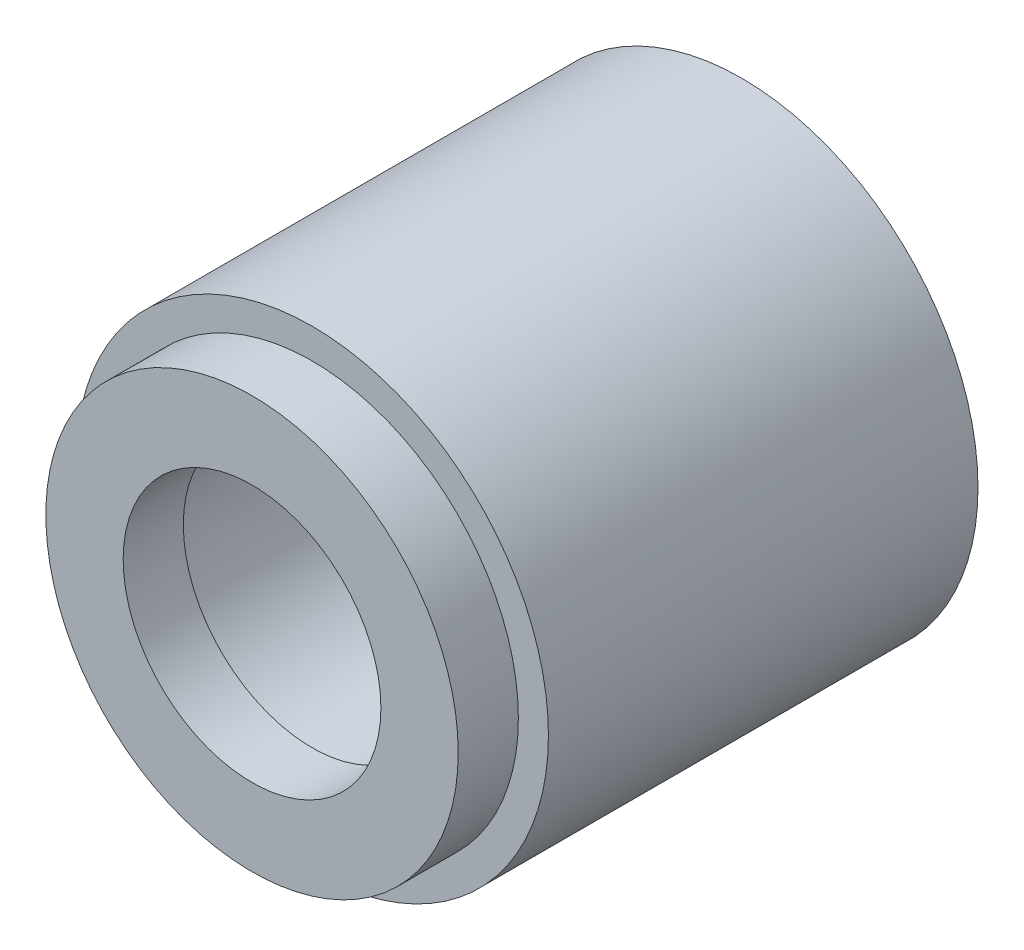
ISO-10303-21;
HEADER;
FILE_DESCRIPTION(('STEP AP214'),'2;1');
FILE_NAME('part.step','',(''),(''),'','','');
FILE_SCHEMA(('AUTOMOTIVE_DESIGN { 1 0 10303 214 1 1 1 1 }'));
ENDSEC;
DATA;
#1=APPLICATION_CONTEXT('core data for automotive mechanical design processes');
#2=APPLICATION_PROTOCOL_DEFINITION('international standard','automotive_design',2000,#1);
#3=PRODUCT_CONTEXT('',#1,'mechanical');
#4=PRODUCT('Part','Part','',(#3));
#5=PRODUCT_RELATED_PRODUCT_CATEGORY('part','',(#4));
#6=PRODUCT_DEFINITION_FORMATION('','',#4);
#7=PRODUCT_DEFINITION_CONTEXT('part definition',#1,'design');
#8=PRODUCT_DEFINITION('design','',#6,#7);
#9=PRODUCT_DEFINITION_SHAPE('','',#8);
#10=(LENGTH_UNIT() NAMED_UNIT(*) SI_UNIT(.MILLI.,.METRE.));
#11=(NAMED_UNIT(*) PLANE_ANGLE_UNIT() SI_UNIT($,.RADIAN.));
#12=(NAMED_UNIT(*) SI_UNIT($,.STERADIAN.) SOLID_ANGLE_UNIT());
#13=UNCERTAINTY_MEASURE_WITH_UNIT(LENGTH_MEASURE(1.E-05),#10,'distance_accuracy_value','');
#14=(GEOMETRIC_REPRESENTATION_CONTEXT(3) GLOBAL_UNCERTAINTY_ASSIGNED_CONTEXT((#13)) GLOBAL_UNIT_ASSIGNED_CONTEXT((#10,
#11,#12)) REPRESENTATION_CONTEXT('',''));
#15=CARTESIAN_POINT('',(0.,0.,0.));
#16=DIRECTION('',(0.,0.,1.));
#17=DIRECTION('',(1.,0.,0.));
#18=AXIS2_PLACEMENT_3D('',#15,#16,#17);
#19=CARTESIAN_POINT('',(0.,0.,5.));
#20=DIRECTION('',(0.,0.,1.));
#21=DIRECTION('',(1.,0.,0.));
#22=AXIS2_PLACEMENT_3D('',#19,#20,#21);
#23=PLANE('',#22);
#24=CARTESIAN_POINT('',(0.,0.,5.));
#25=DIRECTION('',(0.,0.,1.));
#26=DIRECTION('',(1.,0.,0.));
#27=AXIS2_PLACEMENT_3D('',#24,#25,#26);
#28=CIRCLE('',#27,2.4);
#29=CARTESIAN_POINT('',(2.4,0.,5.));
#30=VERTEX_POINT('',#29);
#31=EDGE_CURVE('E50',#30,#30,#28,.T.);
#32=ORIENTED_EDGE('',*,*,#31,.F.);
#33=EDGE_LOOP('',(#32));
#34=FACE_BOUND('',#33,.T.);
#35=CARTESIAN_POINT('',(0.,0.,5.));
#36=DIRECTION('',(0.,0.,1.));
#37=DIRECTION('',(1.,0.,0.));
#38=AXIS2_PLACEMENT_3D('',#35,#36,#37);
#39=CIRCLE('',#38,2.75);
#40=CARTESIAN_POINT('',(2.75,0.,5.));
#41=VERTEX_POINT('',#40);
#42=EDGE_CURVE('E10',#41,#41,#39,.T.);
#43=ORIENTED_EDGE('',*,*,#42,.T.);
#44=EDGE_LOOP('',(#43));
#45=FACE_BOUND('',#44,.T.);
#46=ADVANCED_FACE('F31',(#34,#45),#23,.T.);
#47=CARTESIAN_POINT('',(0.,0.,0.));
#48=DIRECTION('',(0.,0.,1.));
#49=DIRECTION('',(1.,0.,0.));
#50=AXIS2_PLACEMENT_3D('',#47,#48,#49);
#51=PLANE('',#50);
#52=CARTESIAN_POINT('',(0.,0.,0.));
#53=DIRECTION('',(0.,0.,1.));
#54=DIRECTION('',(1.,0.,0.));
#55=AXIS2_PLACEMENT_3D('',#52,#53,#54);
#56=CIRCLE('',#55,2.75);
#57=CARTESIAN_POINT('',(2.75,0.,0.));
#58=VERTEX_POINT('',#57);
#59=EDGE_CURVE('E35',#58,#58,#56,.T.);
#60=ORIENTED_EDGE('',*,*,#59,.F.);
#61=EDGE_LOOP('',(#60));
#62=FACE_BOUND('',#61,.T.);
#63=CARTESIAN_POINT('',(0.,0.,0.));
#64=DIRECTION('',(0.,0.,1.));
#65=DIRECTION('',(1.,0.,0.));
#66=AXIS2_PLACEMENT_3D('',#63,#64,#65);
#67=CIRCLE('',#66,1.6);
#68=CARTESIAN_POINT('',(1.6,0.,0.));
#69=VERTEX_POINT('',#68);
#70=EDGE_CURVE('E42',#69,#69,#67,.T.);
#71=ORIENTED_EDGE('',*,*,#70,.T.);
#72=EDGE_LOOP('',(#71));
#73=FACE_BOUND('',#72,.T.);
#74=ADVANCED_FACE('F82',(#62,#73),#51,.F.);
#75=CARTESIAN_POINT('',(0.,0.,5.));
#76=DIRECTION('',(0.,0.,-1.));
#77=DIRECTION('',(-1.,0.,0.));
#78=AXIS2_PLACEMENT_3D('',#75,#76,#77);
#79=CYLINDRICAL_SURFACE('',#78,2.75);
#80=ORIENTED_EDGE('',*,*,#42,.F.);
#81=EDGE_LOOP('',(#80));
#82=FACE_BOUND('',#81,.T.);
#83=ORIENTED_EDGE('',*,*,#59,.T.);
#84=EDGE_LOOP('',(#83));
#85=FACE_BOUND('',#84,.T.);
#86=ADVANCED_FACE('F33',(#82,#85),#79,.T.);
#87=CARTESIAN_POINT('',(0.,0.,5.));
#88=DIRECTION('',(0.,0.,-1.));
#89=DIRECTION('',(-1.,0.,0.));
#90=AXIS2_PLACEMENT_3D('',#87,#88,#89);
#91=CYLINDRICAL_SURFACE('',#90,1.6);
#92=CARTESIAN_POINT('',(0.,0.,5.));
#93=DIRECTION('',(0.,0.,1.));
#94=DIRECTION('',(1.,0.,0.));
#95=AXIS2_PLACEMENT_3D('',#92,#93,#94);
#96=CIRCLE('',#95,1.6);
#97=CARTESIAN_POINT('',(1.6,0.,5.));
#98=VERTEX_POINT('',#97);
#99=EDGE_CURVE('E46',#98,#98,#96,.T.);
#100=ORIENTED_EDGE('',*,*,#99,.T.);
#101=EDGE_LOOP('',(#100));
#102=FACE_BOUND('',#101,.T.);
#103=ORIENTED_EDGE('',*,*,#70,.F.);
#104=EDGE_LOOP('',(#103));
#105=FACE_BOUND('',#104,.T.);
#106=ADVANCED_FACE('F77',(#102,#105),#91,.F.);
#107=CARTESIAN_POINT('',(0.,0.,5.));
#108=DIRECTION('',(0.,0.,1.));
#109=DIRECTION('',(1.,0.,0.));
#110=AXIS2_PLACEMENT_3D('',#107,#108,#109);
#111=PLANE('',#110);
#112=CARTESIAN_POINT('',(0.,0.,5.));
#113=DIRECTION('',(0.,0.,1.));
#114=DIRECTION('',(1.,0.,0.));
#115=AXIS2_PLACEMENT_3D('',#112,#113,#114);
#116=CIRCLE('',#115,1.5);
#117=CARTESIAN_POINT('',(1.5,0.,5.));
#118=VERTEX_POINT('',#117);
#119=EDGE_CURVE('E56',#118,#118,#116,.T.);
#120=ORIENTED_EDGE('',*,*,#119,.T.);
#121=EDGE_LOOP('',(#120));
#122=FACE_BOUND('',#121,.T.);
#123=ORIENTED_EDGE('',*,*,#99,.F.);
#124=EDGE_LOOP('',(#123));
#125=FACE_BOUND('',#124,.T.);
#126=ADVANCED_FACE('F68',(#122,#125),#111,.F.);
#127=CARTESIAN_POINT('',(0.,0.,5.7));
#128=DIRECTION('',(0.,0.,1.));
#129=DIRECTION('',(1.,0.,0.));
#130=AXIS2_PLACEMENT_3D('',#127,#128,#129);
#131=PLANE('',#130);
#132=CARTESIAN_POINT('',(0.,0.,5.7));
#133=DIRECTION('',(0.,0.,1.));
#134=DIRECTION('',(1.,0.,0.));
#135=AXIS2_PLACEMENT_3D('',#132,#133,#134);
#136=CIRCLE('',#135,2.4);
#137=CARTESIAN_POINT('',(2.4,0.,5.7));
#138=VERTEX_POINT('',#137);
#139=EDGE_CURVE('E49',#138,#138,#136,.T.);
#140=ORIENTED_EDGE('',*,*,#139,.T.);
#141=EDGE_LOOP('',(#140));
#142=FACE_BOUND('',#141,.T.);
#143=CARTESIAN_POINT('',(0.,0.,5.7));
#144=DIRECTION('',(0.,0.,1.));
#145=DIRECTION('',(1.,0.,0.));
#146=AXIS2_PLACEMENT_3D('',#143,#144,#145);
#147=CIRCLE('',#146,1.5);
#148=CARTESIAN_POINT('',(1.5,0.,5.7));
#149=VERTEX_POINT('',#148);
#150=EDGE_CURVE('E53',#149,#149,#147,.T.);
#151=ORIENTED_EDGE('',*,*,#150,.F.);
#152=EDGE_LOOP('',(#151));
#153=FACE_BOUND('',#152,.T.);
#154=ADVANCED_FACE('F65',(#142,#153),#131,.T.);
#155=CARTESIAN_POINT('',(0.,0.,5.7));
#156=DIRECTION('',(0.,0.,-1.));
#157=DIRECTION('',(-1.,0.,0.));
#158=AXIS2_PLACEMENT_3D('',#155,#156,#157);
#159=CYLINDRICAL_SURFACE('',#158,2.4);
#160=ORIENTED_EDGE('',*,*,#139,.F.);
#161=EDGE_LOOP('',(#160));
#162=FACE_BOUND('',#161,.T.);
#163=ORIENTED_EDGE('',*,*,#31,.T.);
#164=EDGE_LOOP('',(#163));
#165=FACE_BOUND('',#164,.T.);
#166=ADVANCED_FACE('F67',(#162,#165),#159,.T.);
#167=CARTESIAN_POINT('',(0.,0.,5.7));
#168=DIRECTION('',(0.,0.,-1.));
#169=DIRECTION('',(-1.,0.,0.));
#170=AXIS2_PLACEMENT_3D('',#167,#168,#169);
#171=CYLINDRICAL_SURFACE('',#170,1.5);
#172=ORIENTED_EDGE('',*,*,#150,.T.);
#173=EDGE_LOOP('',(#172));
#174=FACE_BOUND('',#173,.T.);
#175=ORIENTED_EDGE('',*,*,#119,.F.);
#176=EDGE_LOOP('',(#175));
#177=FACE_BOUND('',#176,.T.);
#178=ADVANCED_FACE('F62',(#174,#177),#171,.F.);
#179=CLOSED_SHELL('',(#46,#74,#86,#106,#126,#154,#166,#178));
#180=MANIFOLD_SOLID_BREP('B2',#179);
#181=ADVANCED_BREP_SHAPE_REPRESENTATION('',(#18,#180),#14);
#182=SHAPE_DEFINITION_REPRESENTATION(#9,#181);
ENDSEC;
END-ISO-10303-21;
